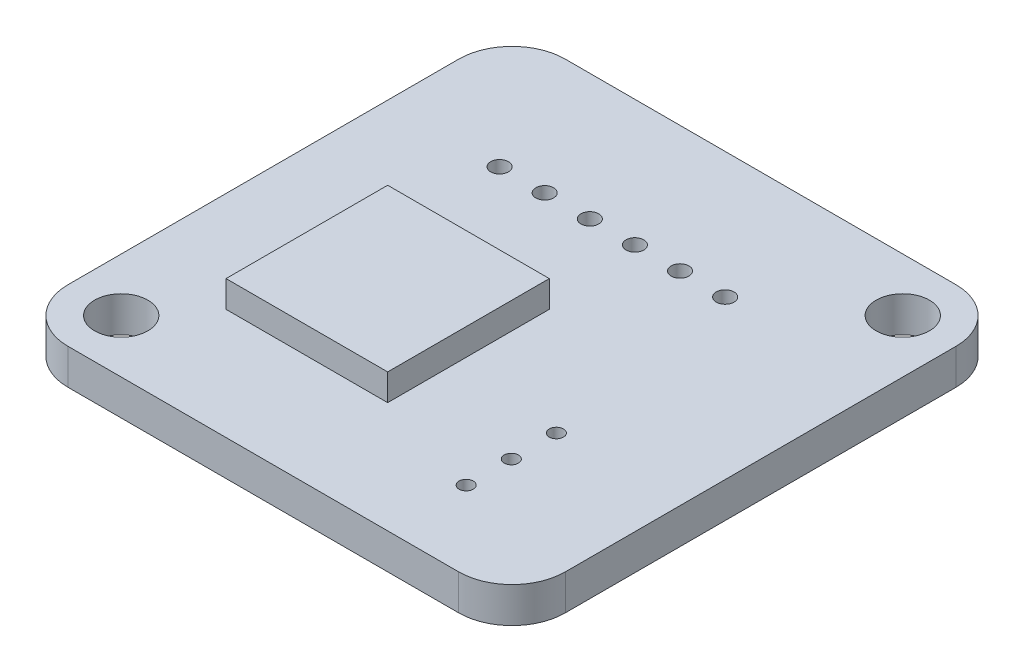
ISO-10303-21;
HEADER;
FILE_DESCRIPTION(('STEP AP214'),'2;1');
FILE_NAME('part.step','',(''),(''),'','','');
FILE_SCHEMA(('AUTOMOTIVE_DESIGN { 1 0 10303 214 1 1 1 1 }'));
ENDSEC;
DATA;
#1=APPLICATION_CONTEXT('core data for automotive mechanical design processes');
#2=APPLICATION_PROTOCOL_DEFINITION('international standard','automotive_design',2000,#1);
#3=PRODUCT_CONTEXT('',#1,'mechanical');
#4=PRODUCT('Part','Part','',(#3));
#5=PRODUCT_RELATED_PRODUCT_CATEGORY('part','',(#4));
#6=PRODUCT_DEFINITION_FORMATION('','',#4);
#7=PRODUCT_DEFINITION_CONTEXT('part definition',#1,'design');
#8=PRODUCT_DEFINITION('design','',#6,#7);
#9=PRODUCT_DEFINITION_SHAPE('','',#8);
#10=(LENGTH_UNIT() NAMED_UNIT(*) SI_UNIT(.MILLI.,.METRE.));
#11=(NAMED_UNIT(*) PLANE_ANGLE_UNIT() SI_UNIT($,.RADIAN.));
#12=(NAMED_UNIT(*) SI_UNIT($,.STERADIAN.) SOLID_ANGLE_UNIT());
#13=UNCERTAINTY_MEASURE_WITH_UNIT(LENGTH_MEASURE(1.E-05),#10,'distance_accuracy_value','');
#14=(GEOMETRIC_REPRESENTATION_CONTEXT(3) GLOBAL_UNCERTAINTY_ASSIGNED_CONTEXT((#13)) GLOBAL_UNIT_ASSIGNED_CONTEXT((#10,
#11,#12)) REPRESENTATION_CONTEXT('',''));
#15=CARTESIAN_POINT('',(0.,0.,0.));
#16=DIRECTION('',(0.,0.,1.));
#17=DIRECTION('',(1.,0.,0.));
#18=AXIS2_PLACEMENT_3D('',#15,#16,#17);
#19=CARTESIAN_POINT('',(22.,2.,0.));
#20=DIRECTION('',(0.,1.,0.));
#21=DIRECTION('',(0.,0.,1.));
#22=AXIS2_PLACEMENT_3D('',#19,#20,#21);
#23=PLANE('',#22);
#24=CARTESIAN_POINT('',(17.98,2.,-6.52));
#25=DIRECTION('',(0.,1.,0.));
#26=DIRECTION('',(0.,0.,1.));
#27=AXIS2_PLACEMENT_3D('',#24,#25,#26);
#28=CIRCLE('',#27,0.400000000000001);
#29=CARTESIAN_POINT('',(17.98,2.,-6.12));
#30=VERTEX_POINT('',#29);
#31=EDGE_CURVE('E290',#30,#30,#28,.T.);
#32=ORIENTED_EDGE('',*,*,#31,.F.);
#33=EDGE_LOOP('',(#32));
#34=FACE_BOUND('',#33,.T.);
#35=CARTESIAN_POINT('',(17.98,2.,-3.98));
#36=DIRECTION('',(0.,1.,0.));
#37=DIRECTION('',(0.,0.,1.));
#38=AXIS2_PLACEMENT_3D('',#35,#36,#37);
#39=CIRCLE('',#38,0.400000000000001);
#40=CARTESIAN_POINT('',(17.98,2.,-3.58));
#41=VERTEX_POINT('',#40);
#42=EDGE_CURVE('E284',#41,#41,#39,.T.);
#43=ORIENTED_EDGE('',*,*,#42,.F.);
#44=EDGE_LOOP('',(#43));
#45=FACE_BOUND('',#44,.T.);
#46=CARTESIAN_POINT('',(17.98,2.,-1.44));
#47=DIRECTION('',(0.,1.,0.));
#48=DIRECTION('',(0.,0.,1.));
#49=AXIS2_PLACEMENT_3D('',#46,#47,#48);
#50=CIRCLE('',#49,0.400000000000001);
#51=CARTESIAN_POINT('',(17.98,2.,-1.04));
#52=VERTEX_POINT('',#51);
#53=EDGE_CURVE('E278',#52,#52,#50,.T.);
#54=ORIENTED_EDGE('',*,*,#53,.F.);
#55=EDGE_LOOP('',(#54));
#56=FACE_BOUND('',#55,.T.);
#57=CARTESIAN_POINT('',(22.,2.,-22.));
#58=DIRECTION('',(0.,1.,0.));
#59=DIRECTION('',(0.,0.,1.));
#60=AXIS2_PLACEMENT_3D('',#57,#58,#59);
#61=CIRCLE('',#60,1.5);
#62=CARTESIAN_POINT('',(22.,2.,-20.5));
#63=VERTEX_POINT('',#62);
#64=EDGE_CURVE('E199',#63,#63,#61,.T.);
#65=ORIENTED_EDGE('',*,*,#64,.F.);
#66=EDGE_LOOP('',(#65));
#67=FACE_BOUND('',#66,.T.);
#68=CARTESIAN_POINT('',(22.,2.,0.));
#69=DIRECTION('',(0.,1.,0.));
#70=DIRECTION('',(0.,0.,1.));
#71=AXIS2_PLACEMENT_3D('',#68,#69,#70);
#72=CIRCLE('',#71,3.);
#73=CARTESIAN_POINT('',(22.,2.,3.));
#74=VERTEX_POINT('',#73);
#75=CARTESIAN_POINT('',(25.,2.,0.));
#76=VERTEX_POINT('',#75);
#77=EDGE_CURVE('E162',#74,#76,#72,.T.);
#78=ORIENTED_EDGE('',*,*,#77,.T.);
#79=DIRECTION('',(0.,0.,-1.));
#80=VECTOR('',#79,1.);
#81=CARTESIAN_POINT('',(25.,2.,0.));
#82=LINE('',#81,#80);
#83=CARTESIAN_POINT('',(25.,2.,-22.));
#84=VERTEX_POINT('',#83);
#85=EDGE_CURVE('E102',#76,#84,#82,.T.);
#86=ORIENTED_EDGE('',*,*,#85,.T.);
#87=CARTESIAN_POINT('',(22.,2.,-22.));
#88=DIRECTION('',(0.,1.,0.));
#89=DIRECTION('',(0.,0.,1.));
#90=AXIS2_PLACEMENT_3D('',#87,#88,#89);
#91=CIRCLE('',#90,3.);
#92=CARTESIAN_POINT('',(22.,2.,-25.));
#93=VERTEX_POINT('',#92);
#94=EDGE_CURVE('E177',#84,#93,#91,.T.);
#95=ORIENTED_EDGE('',*,*,#94,.T.);
#96=DIRECTION('',(-1.,0.,0.));
#97=VECTOR('',#96,1.);
#98=CARTESIAN_POINT('',(0.,2.,-25.));
#99=LINE('',#98,#97);
#100=CARTESIAN_POINT('',(0.,2.,-25.));
#101=VERTEX_POINT('',#100);
#102=EDGE_CURVE('E190',#93,#101,#99,.T.);
#103=ORIENTED_EDGE('',*,*,#102,.T.);
#104=CARTESIAN_POINT('',(0.,2.,-22.));
#105=DIRECTION('',(0.,1.,0.));
#106=DIRECTION('',(0.,0.,-1.));
#107=AXIS2_PLACEMENT_3D('',#104,#105,#106);
#108=CIRCLE('',#107,3.);
#109=CARTESIAN_POINT('',(-3.,2.,-22.));
#110=VERTEX_POINT('',#109);
#111=EDGE_CURVE('E125',#101,#110,#108,.T.);
#112=ORIENTED_EDGE('',*,*,#111,.T.);
#113=DIRECTION('',(0.,0.,1.));
#114=VECTOR('',#113,1.);
#115=CARTESIAN_POINT('',(-3.,2.,0.));
#116=LINE('',#115,#114);
#117=CARTESIAN_POINT('',(-3.,2.,0.));
#118=VERTEX_POINT('',#117);
#119=EDGE_CURVE('E118',#110,#118,#116,.T.);
#120=ORIENTED_EDGE('',*,*,#119,.T.);
#121=CARTESIAN_POINT('',(0.,2.,0.));
#122=DIRECTION('',(0.,1.,0.));
#123=DIRECTION('',(0.,0.,-1.));
#124=AXIS2_PLACEMENT_3D('',#121,#122,#123);
#125=CIRCLE('',#124,3.);
#126=CARTESIAN_POINT('',(0.,2.,3.));
#127=VERTEX_POINT('',#126);
#128=EDGE_CURVE('E122',#118,#127,#125,.T.);
#129=ORIENTED_EDGE('',*,*,#128,.T.);
#130=DIRECTION('',(1.,0.,0.));
#131=VECTOR('',#130,1.);
#132=CARTESIAN_POINT('',(0.,2.,3.));
#133=LINE('',#132,#131);
#134=EDGE_CURVE('E61',#127,#74,#133,.T.);
#135=ORIENTED_EDGE('',*,*,#134,.T.);
#136=EDGE_LOOP('',(#78,#86,#95,#103,#112,#120,#129,#135));
#137=FACE_BOUND('',#136,.T.);
#138=CARTESIAN_POINT('',(0.,2.,0.));
#139=DIRECTION('',(0.,1.,0.));
#140=DIRECTION('',(0.,0.,1.));
#141=AXIS2_PLACEMENT_3D('',#138,#139,#140);
#142=CIRCLE('',#141,1.5);
#143=CARTESIAN_POINT('',(0.,2.,1.5));
#144=VERTEX_POINT('',#143);
#145=EDGE_CURVE('E150',#144,#144,#142,.T.);
#146=ORIENTED_EDGE('',*,*,#145,.F.);
#147=EDGE_LOOP('',(#146));
#148=FACE_BOUND('',#147,.T.);
#149=CARTESIAN_POINT('',(5.94,2.,-17.9));
#150=DIRECTION('',(0.,1.,0.));
#151=DIRECTION('',(0.,0.,1.));
#152=AXIS2_PLACEMENT_3D('',#149,#150,#151);
#153=CIRCLE('',#152,0.500000000000003);
#154=CARTESIAN_POINT('',(5.94,2.,-17.4));
#155=VERTEX_POINT('',#154);
#156=EDGE_CURVE('E210',#155,#155,#153,.T.);
#157=ORIENTED_EDGE('',*,*,#156,.F.);
#158=EDGE_LOOP('',(#157));
#159=FACE_BOUND('',#158,.T.);
#160=CARTESIAN_POINT('',(8.47999999999999,2.,-17.9));
#161=DIRECTION('',(0.,1.,0.));
#162=DIRECTION('',(0.,0.,1.));
#163=AXIS2_PLACEMENT_3D('',#160,#161,#162);
#164=CIRCLE('',#163,0.500000000000003);
#165=CARTESIAN_POINT('',(8.47999999999999,2.,-17.4));
#166=VERTEX_POINT('',#165);
#167=EDGE_CURVE('E216',#166,#166,#164,.T.);
#168=ORIENTED_EDGE('',*,*,#167,.F.);
#169=EDGE_LOOP('',(#168));
#170=FACE_BOUND('',#169,.T.);
#171=CARTESIAN_POINT('',(11.02,2.,-17.9));
#172=DIRECTION('',(0.,1.,0.));
#173=DIRECTION('',(0.,0.,1.));
#174=AXIS2_PLACEMENT_3D('',#171,#172,#173);
#175=CIRCLE('',#174,0.500000000000003);
#176=CARTESIAN_POINT('',(11.02,2.,-17.4));
#177=VERTEX_POINT('',#176);
#178=EDGE_CURVE('E222',#177,#177,#175,.T.);
#179=ORIENTED_EDGE('',*,*,#178,.F.);
#180=EDGE_LOOP('',(#179));
#181=FACE_BOUND('',#180,.T.);
#182=CARTESIAN_POINT('',(13.56,2.,-17.9));
#183=DIRECTION('',(0.,1.,0.));
#184=DIRECTION('',(0.,0.,1.));
#185=AXIS2_PLACEMENT_3D('',#182,#183,#184);
#186=CIRCLE('',#185,0.500000000000003);
#187=CARTESIAN_POINT('',(13.56,2.,-17.4));
#188=VERTEX_POINT('',#187);
#189=EDGE_CURVE('E228',#188,#188,#186,.T.);
#190=ORIENTED_EDGE('',*,*,#189,.F.);
#191=EDGE_LOOP('',(#190));
#192=FACE_BOUND('',#191,.T.);
#193=CARTESIAN_POINT('',(16.1,2.,-17.9));
#194=DIRECTION('',(0.,1.,0.));
#195=DIRECTION('',(0.,0.,1.));
#196=AXIS2_PLACEMENT_3D('',#193,#194,#195);
#197=CIRCLE('',#196,0.500000000000003);
#198=CARTESIAN_POINT('',(16.1,2.,-17.4));
#199=VERTEX_POINT('',#198);
#200=EDGE_CURVE('E234',#199,#199,#197,.T.);
#201=ORIENTED_EDGE('',*,*,#200,.F.);
#202=EDGE_LOOP('',(#201));
#203=FACE_BOUND('',#202,.T.);
#204=CARTESIAN_POINT('',(3.4,2.,-17.9));
#205=DIRECTION('',(0.,1.,0.));
#206=DIRECTION('',(0.,0.,1.));
#207=AXIS2_PLACEMENT_3D('',#204,#205,#206);
#208=CIRCLE('',#207,0.500000000000002);
#209=CARTESIAN_POINT('',(3.4,2.,-17.4));
#210=VERTEX_POINT('',#209);
#211=EDGE_CURVE('E240',#210,#210,#208,.T.);
#212=ORIENTED_EDGE('',*,*,#211,.F.);
#213=EDGE_LOOP('',(#212));
#214=FACE_BOUND('',#213,.T.);
#215=DIRECTION('',(0.,0.,1.));
#216=VECTOR('',#215,1.);
#217=CARTESIAN_POINT('',(2.65,2.,-12.35));
#218=LINE('',#217,#216);
#219=CARTESIAN_POINT('',(2.65,2.,-12.35));
#220=VERTEX_POINT('',#219);
#221=CARTESIAN_POINT('',(2.65,2.,-3.25));
#222=VERTEX_POINT('',#221);
#223=EDGE_CURVE('E259',#220,#222,#218,.T.);
#224=ORIENTED_EDGE('',*,*,#223,.F.);
#225=DIRECTION('',(-1.,0.,0.));
#226=VECTOR('',#225,1.);
#227=CARTESIAN_POINT('',(2.65,2.,-12.35));
#228=LINE('',#227,#226);
#229=CARTESIAN_POINT('',(11.75,2.,-12.35));
#230=VERTEX_POINT('',#229);
#231=EDGE_CURVE('E262',#230,#220,#228,.T.);
#232=ORIENTED_EDGE('',*,*,#231,.F.);
#233=DIRECTION('',(0.,0.,-1.));
#234=VECTOR('',#233,1.);
#235=CARTESIAN_POINT('',(11.75,2.,-12.35));
#236=LINE('',#235,#234);
#237=CARTESIAN_POINT('',(11.75,2.,-3.25));
#238=VERTEX_POINT('',#237);
#239=EDGE_CURVE('E254',#238,#230,#236,.T.);
#240=ORIENTED_EDGE('',*,*,#239,.F.);
#241=DIRECTION('',(1.,0.,0.));
#242=VECTOR('',#241,1.);
#243=CARTESIAN_POINT('',(2.65,2.,-3.25));
#244=LINE('',#243,#242);
#245=EDGE_CURVE('E257',#222,#238,#244,.T.);
#246=ORIENTED_EDGE('',*,*,#245,.F.);
#247=EDGE_LOOP('',(#224,#232,#240,#246));
#248=FACE_BOUND('',#247,.T.);
#249=ADVANCED_FACE('F37',(#34,#45,#56,#67,#137,#148,#159,#170,#181,#192,#203,#214,#248),#23,.T.);
#250=CARTESIAN_POINT('',(22.,0.,0.));
#251=DIRECTION('',(0.,1.,0.));
#252=DIRECTION('',(0.,0.,1.));
#253=AXIS2_PLACEMENT_3D('',#250,#251,#252);
#254=PLANE('',#253);
#255=CARTESIAN_POINT('',(17.98,0.,-6.52));
#256=DIRECTION('',(0.,1.,0.));
#257=DIRECTION('',(0.,0.,1.));
#258=AXIS2_PLACEMENT_3D('',#255,#256,#257);
#259=CIRCLE('',#258,0.400000000000001);
#260=CARTESIAN_POINT('',(17.98,0.,-6.12));
#261=VERTEX_POINT('',#260);
#262=EDGE_CURVE('E287',#261,#261,#259,.F.);
#263=ORIENTED_EDGE('',*,*,#262,.F.);
#264=EDGE_LOOP('',(#263));
#265=FACE_BOUND('',#264,.T.);
#266=CARTESIAN_POINT('',(17.98,0.,-3.98));
#267=DIRECTION('',(0.,1.,0.));
#268=DIRECTION('',(0.,0.,1.));
#269=AXIS2_PLACEMENT_3D('',#266,#267,#268);
#270=CIRCLE('',#269,0.400000000000001);
#271=CARTESIAN_POINT('',(17.98,0.,-3.58));
#272=VERTEX_POINT('',#271);
#273=EDGE_CURVE('E281',#272,#272,#270,.F.);
#274=ORIENTED_EDGE('',*,*,#273,.F.);
#275=EDGE_LOOP('',(#274));
#276=FACE_BOUND('',#275,.T.);
#277=CARTESIAN_POINT('',(17.98,0.,-1.44));
#278=DIRECTION('',(0.,1.,0.));
#279=DIRECTION('',(0.,0.,1.));
#280=AXIS2_PLACEMENT_3D('',#277,#278,#279);
#281=CIRCLE('',#280,0.400000000000001);
#282=CARTESIAN_POINT('',(17.98,0.,-1.04));
#283=VERTEX_POINT('',#282);
#284=EDGE_CURVE('E265',#283,#283,#281,.F.);
#285=ORIENTED_EDGE('',*,*,#284,.F.);
#286=EDGE_LOOP('',(#285));
#287=FACE_BOUND('',#286,.T.);
#288=CARTESIAN_POINT('',(3.4,0.,-17.9));
#289=DIRECTION('',(0.,1.,0.));
#290=DIRECTION('',(0.,0.,1.));
#291=AXIS2_PLACEMENT_3D('',#288,#289,#290);
#292=CIRCLE('',#291,0.500000000000002);
#293=CARTESIAN_POINT('',(3.4,0.,-17.4));
#294=VERTEX_POINT('',#293);
#295=EDGE_CURVE('E237',#294,#294,#292,.F.);
#296=ORIENTED_EDGE('',*,*,#295,.F.);
#297=EDGE_LOOP('',(#296));
#298=FACE_BOUND('',#297,.T.);
#299=CARTESIAN_POINT('',(16.1,0.,-17.9));
#300=DIRECTION('',(0.,1.,0.));
#301=DIRECTION('',(0.,0.,1.));
#302=AXIS2_PLACEMENT_3D('',#299,#300,#301);
#303=CIRCLE('',#302,0.500000000000003);
#304=CARTESIAN_POINT('',(16.1,0.,-17.4));
#305=VERTEX_POINT('',#304);
#306=EDGE_CURVE('E231',#305,#305,#303,.F.);
#307=ORIENTED_EDGE('',*,*,#306,.F.);
#308=EDGE_LOOP('',(#307));
#309=FACE_BOUND('',#308,.T.);
#310=CARTESIAN_POINT('',(13.56,0.,-17.9));
#311=DIRECTION('',(0.,1.,0.));
#312=DIRECTION('',(0.,0.,1.));
#313=AXIS2_PLACEMENT_3D('',#310,#311,#312);
#314=CIRCLE('',#313,0.500000000000003);
#315=CARTESIAN_POINT('',(13.56,0.,-17.4));
#316=VERTEX_POINT('',#315);
#317=EDGE_CURVE('E225',#316,#316,#314,.F.);
#318=ORIENTED_EDGE('',*,*,#317,.F.);
#319=EDGE_LOOP('',(#318));
#320=FACE_BOUND('',#319,.T.);
#321=CARTESIAN_POINT('',(11.02,0.,-17.9));
#322=DIRECTION('',(0.,1.,0.));
#323=DIRECTION('',(0.,0.,1.));
#324=AXIS2_PLACEMENT_3D('',#321,#322,#323);
#325=CIRCLE('',#324,0.500000000000003);
#326=CARTESIAN_POINT('',(11.02,0.,-17.4));
#327=VERTEX_POINT('',#326);
#328=EDGE_CURVE('E219',#327,#327,#325,.F.);
#329=ORIENTED_EDGE('',*,*,#328,.F.);
#330=EDGE_LOOP('',(#329));
#331=FACE_BOUND('',#330,.T.);
#332=CARTESIAN_POINT('',(8.47999999999999,0.,-17.9));
#333=DIRECTION('',(0.,1.,0.));
#334=DIRECTION('',(0.,0.,1.));
#335=AXIS2_PLACEMENT_3D('',#332,#333,#334);
#336=CIRCLE('',#335,0.500000000000003);
#337=CARTESIAN_POINT('',(8.47999999999999,0.,-17.4));
#338=VERTEX_POINT('',#337);
#339=EDGE_CURVE('E213',#338,#338,#336,.F.);
#340=ORIENTED_EDGE('',*,*,#339,.F.);
#341=EDGE_LOOP('',(#340));
#342=FACE_BOUND('',#341,.T.);
#343=CARTESIAN_POINT('',(5.94,0.,-17.9));
#344=DIRECTION('',(0.,1.,0.));
#345=DIRECTION('',(0.,0.,1.));
#346=AXIS2_PLACEMENT_3D('',#343,#344,#345);
#347=CIRCLE('',#346,0.500000000000003);
#348=CARTESIAN_POINT('',(5.94,0.,-17.4));
#349=VERTEX_POINT('',#348);
#350=EDGE_CURVE('E205',#349,#349,#347,.F.);
#351=ORIENTED_EDGE('',*,*,#350,.F.);
#352=EDGE_LOOP('',(#351));
#353=FACE_BOUND('',#352,.T.);
#354=CARTESIAN_POINT('',(0.,0.,0.));
#355=DIRECTION('',(0.,1.,0.));
#356=DIRECTION('',(0.,0.,1.));
#357=AXIS2_PLACEMENT_3D('',#354,#355,#356);
#358=CIRCLE('',#357,1.5);
#359=CARTESIAN_POINT('',(0.,0.,1.5));
#360=VERTEX_POINT('',#359);
#361=EDGE_CURVE('E196',#360,#360,#358,.T.);
#362=ORIENTED_EDGE('',*,*,#361,.T.);
#363=EDGE_LOOP('',(#362));
#364=FACE_BOUND('',#363,.T.);
#365=CARTESIAN_POINT('',(22.,0.,0.));
#366=DIRECTION('',(0.,1.,0.));
#367=DIRECTION('',(0.,0.,1.));
#368=AXIS2_PLACEMENT_3D('',#365,#366,#367);
#369=CIRCLE('',#368,3.);
#370=CARTESIAN_POINT('',(22.,0.,3.));
#371=VERTEX_POINT('',#370);
#372=CARTESIAN_POINT('',(25.,0.,0.));
#373=VERTEX_POINT('',#372);
#374=EDGE_CURVE('E146',#371,#373,#369,.T.);
#375=ORIENTED_EDGE('',*,*,#374,.F.);
#376=DIRECTION('',(1.,0.,0.));
#377=VECTOR('',#376,1.);
#378=CARTESIAN_POINT('',(0.,0.,3.));
#379=LINE('',#378,#377);
#380=CARTESIAN_POINT('',(0.,0.,3.));
#381=VERTEX_POINT('',#380);
#382=EDGE_CURVE('E94',#381,#371,#379,.T.);
#383=ORIENTED_EDGE('',*,*,#382,.F.);
#384=CARTESIAN_POINT('',(0.,0.,0.));
#385=DIRECTION('',(0.,1.,0.));
#386=DIRECTION('',(0.,0.,-1.));
#387=AXIS2_PLACEMENT_3D('',#384,#385,#386);
#388=CIRCLE('',#387,3.);
#389=CARTESIAN_POINT('',(-3.,0.,0.));
#390=VERTEX_POINT('',#389);
#391=EDGE_CURVE('E159',#390,#381,#388,.T.);
#392=ORIENTED_EDGE('',*,*,#391,.F.);
#393=DIRECTION('',(0.,0.,1.));
#394=VECTOR('',#393,1.);
#395=CARTESIAN_POINT('',(-3.,0.,0.));
#396=LINE('',#395,#394);
#397=CARTESIAN_POINT('',(-3.,0.,-22.));
#398=VERTEX_POINT('',#397);
#399=EDGE_CURVE('E134',#398,#390,#396,.T.);
#400=ORIENTED_EDGE('',*,*,#399,.F.);
#401=CARTESIAN_POINT('',(0.,0.,-22.));
#402=DIRECTION('',(0.,1.,0.));
#403=DIRECTION('',(0.,0.,-1.));
#404=AXIS2_PLACEMENT_3D('',#401,#402,#403);
#405=CIRCLE('',#404,3.);
#406=CARTESIAN_POINT('',(0.,0.,-25.));
#407=VERTEX_POINT('',#406);
#408=EDGE_CURVE('E156',#407,#398,#405,.T.);
#409=ORIENTED_EDGE('',*,*,#408,.F.);
#410=DIRECTION('',(-1.,0.,0.));
#411=VECTOR('',#410,1.);
#412=CARTESIAN_POINT('',(0.,0.,-25.));
#413=LINE('',#412,#411);
#414=CARTESIAN_POINT('',(22.,0.,-25.));
#415=VERTEX_POINT('',#414);
#416=EDGE_CURVE('E154',#415,#407,#413,.T.);
#417=ORIENTED_EDGE('',*,*,#416,.F.);
#418=CARTESIAN_POINT('',(22.,0.,-22.));
#419=DIRECTION('',(0.,1.,0.));
#420=DIRECTION('',(0.,0.,1.));
#421=AXIS2_PLACEMENT_3D('',#418,#419,#420);
#422=CIRCLE('',#421,3.);
#423=CARTESIAN_POINT('',(25.,0.,-22.));
#424=VERTEX_POINT('',#423);
#425=EDGE_CURVE('E152',#424,#415,#422,.T.);
#426=ORIENTED_EDGE('',*,*,#425,.F.);
#427=DIRECTION('',(0.,0.,-1.));
#428=VECTOR('',#427,1.);
#429=CARTESIAN_POINT('',(25.,0.,0.));
#430=LINE('',#429,#428);
#431=EDGE_CURVE('E149',#373,#424,#430,.T.);
#432=ORIENTED_EDGE('',*,*,#431,.F.);
#433=EDGE_LOOP('',(#375,#383,#392,#400,#409,#417,#426,#432));
#434=FACE_BOUND('',#433,.T.);
#435=CARTESIAN_POINT('',(22.,0.,-22.));
#436=DIRECTION('',(0.,1.,0.));
#437=DIRECTION('',(0.,0.,1.));
#438=AXIS2_PLACEMENT_3D('',#435,#436,#437);
#439=CIRCLE('',#438,1.5);
#440=CARTESIAN_POINT('',(22.,0.,-20.5));
#441=VERTEX_POINT('',#440);
#442=EDGE_CURVE('E202',#441,#441,#439,.T.);
#443=ORIENTED_EDGE('',*,*,#442,.T.);
#444=EDGE_LOOP('',(#443));
#445=FACE_BOUND('',#444,.T.);
#446=ADVANCED_FACE('F181',(#265,#276,#287,#298,#309,#320,#331,#342,#353,#364,#434,#445),#254,.F.);
#447=CARTESIAN_POINT('',(22.,2.,0.));
#448=DIRECTION('',(0.,-1.,0.));
#449=DIRECTION('',(0.,0.,-1.));
#450=AXIS2_PLACEMENT_3D('',#447,#448,#449);
#451=CYLINDRICAL_SURFACE('',#450,3.);
#452=ORIENTED_EDGE('',*,*,#374,.T.);
#453=DIRECTION('',(0.,-1.,0.));
#454=VECTOR('',#453,1.);
#455=CARTESIAN_POINT('',(25.,2.,0.));
#456=LINE('',#455,#454);
#457=EDGE_CURVE('E11',#76,#373,#456,.T.);
#458=ORIENTED_EDGE('',*,*,#457,.F.);
#459=ORIENTED_EDGE('',*,*,#77,.F.);
#460=DIRECTION('',(0.,-1.,0.));
#461=VECTOR('',#460,1.);
#462=CARTESIAN_POINT('',(22.,2.,3.));
#463=LINE('',#462,#461);
#464=EDGE_CURVE('E142',#74,#371,#463,.T.);
#465=ORIENTED_EDGE('',*,*,#464,.T.);
#466=EDGE_LOOP('',(#452,#458,#459,#465));
#467=FACE_BOUND('',#466,.T.);
#468=ADVANCED_FACE('F39',(#467),#451,.T.);
#469=CARTESIAN_POINT('',(25.,2.,0.));
#470=DIRECTION('',(-1.,0.,0.));
#471=DIRECTION('',(0.,0.,1.));
#472=AXIS2_PLACEMENT_3D('',#469,#470,#471);
#473=PLANE('',#472);
#474=ORIENTED_EDGE('',*,*,#431,.T.);
#475=DIRECTION('',(0.,-1.,0.));
#476=VECTOR('',#475,1.);
#477=CARTESIAN_POINT('',(25.,2.,-22.));
#478=LINE('',#477,#476);
#479=EDGE_CURVE('E45',#84,#424,#478,.T.);
#480=ORIENTED_EDGE('',*,*,#479,.F.);
#481=ORIENTED_EDGE('',*,*,#85,.F.);
#482=ORIENTED_EDGE('',*,*,#457,.T.);
#483=EDGE_LOOP('',(#474,#480,#481,#482));
#484=FACE_BOUND('',#483,.T.);
#485=ADVANCED_FACE('F319',(#484),#473,.F.);
#486=CARTESIAN_POINT('',(22.,2.,-22.));
#487=DIRECTION('',(0.,-1.,0.));
#488=DIRECTION('',(0.,0.,-1.));
#489=AXIS2_PLACEMENT_3D('',#486,#487,#488);
#490=CYLINDRICAL_SURFACE('',#489,3.);
#491=ORIENTED_EDGE('',*,*,#425,.T.);
#492=DIRECTION('',(0.,-1.,0.));
#493=VECTOR('',#492,1.);
#494=CARTESIAN_POINT('',(22.,2.,-25.));
#495=LINE('',#494,#493);
#496=EDGE_CURVE('E169',#93,#415,#495,.T.);
#497=ORIENTED_EDGE('',*,*,#496,.F.);
#498=ORIENTED_EDGE('',*,*,#94,.F.);
#499=ORIENTED_EDGE('',*,*,#479,.T.);
#500=EDGE_LOOP('',(#491,#497,#498,#499));
#501=FACE_BOUND('',#500,.T.);
#502=ADVANCED_FACE('F175',(#501),#490,.T.);
#503=CARTESIAN_POINT('',(0.,2.,-25.));
#504=DIRECTION('',(0.,0.,1.));
#505=DIRECTION('',(1.,0.,0.));
#506=AXIS2_PLACEMENT_3D('',#503,#504,#505);
#507=PLANE('',#506);
#508=ORIENTED_EDGE('',*,*,#416,.T.);
#509=DIRECTION('',(0.,-1.,0.));
#510=VECTOR('',#509,1.);
#511=CARTESIAN_POINT('',(0.,2.,-25.));
#512=LINE('',#511,#510);
#513=EDGE_CURVE('E166',#101,#407,#512,.T.);
#514=ORIENTED_EDGE('',*,*,#513,.F.);
#515=ORIENTED_EDGE('',*,*,#102,.F.);
#516=ORIENTED_EDGE('',*,*,#496,.T.);
#517=EDGE_LOOP('',(#508,#514,#515,#516));
#518=FACE_BOUND('',#517,.T.);
#519=ADVANCED_FACE('F186',(#518),#507,.F.);
#520=CARTESIAN_POINT('',(0.,2.,-22.));
#521=DIRECTION('',(0.,-1.,0.));
#522=DIRECTION('',(0.,0.,-1.));
#523=AXIS2_PLACEMENT_3D('',#520,#521,#522);
#524=CYLINDRICAL_SURFACE('',#523,3.);
#525=ORIENTED_EDGE('',*,*,#408,.T.);
#526=DIRECTION('',(0.,-1.,0.));
#527=VECTOR('',#526,1.);
#528=CARTESIAN_POINT('',(-3.,2.,-22.));
#529=LINE('',#528,#527);
#530=EDGE_CURVE('E137',#110,#398,#529,.T.);
#531=ORIENTED_EDGE('',*,*,#530,.F.);
#532=ORIENTED_EDGE('',*,*,#111,.F.);
#533=ORIENTED_EDGE('',*,*,#513,.T.);
#534=EDGE_LOOP('',(#525,#531,#532,#533));
#535=FACE_BOUND('',#534,.T.);
#536=ADVANCED_FACE('F189',(#535),#524,.T.);
#537=CARTESIAN_POINT('',(-3.,2.,0.));
#538=DIRECTION('',(1.,0.,0.));
#539=DIRECTION('',(0.,0.,-1.));
#540=AXIS2_PLACEMENT_3D('',#537,#538,#539);
#541=PLANE('',#540);
#542=ORIENTED_EDGE('',*,*,#399,.T.);
#543=DIRECTION('',(0.,-1.,0.));
#544=VECTOR('',#543,1.);
#545=CARTESIAN_POINT('',(-3.,2.,0.));
#546=LINE('',#545,#544);
#547=EDGE_CURVE('E131',#118,#390,#546,.T.);
#548=ORIENTED_EDGE('',*,*,#547,.F.);
#549=ORIENTED_EDGE('',*,*,#119,.F.);
#550=ORIENTED_EDGE('',*,*,#530,.T.);
#551=EDGE_LOOP('',(#542,#548,#549,#550));
#552=FACE_BOUND('',#551,.T.);
#553=ADVANCED_FACE('F132',(#552),#541,.F.);
#554=CARTESIAN_POINT('',(0.,2.,0.));
#555=DIRECTION('',(0.,-1.,0.));
#556=DIRECTION('',(0.,0.,-1.));
#557=AXIS2_PLACEMENT_3D('',#554,#555,#556);
#558=CYLINDRICAL_SURFACE('',#557,3.);
#559=ORIENTED_EDGE('',*,*,#391,.T.);
#560=DIRECTION('',(0.,-1.,0.));
#561=VECTOR('',#560,1.);
#562=CARTESIAN_POINT('',(0.,2.,3.));
#563=LINE('',#562,#561);
#564=EDGE_CURVE('E138',#127,#381,#563,.T.);
#565=ORIENTED_EDGE('',*,*,#564,.F.);
#566=ORIENTED_EDGE('',*,*,#128,.F.);
#567=ORIENTED_EDGE('',*,*,#547,.T.);
#568=EDGE_LOOP('',(#559,#565,#566,#567));
#569=FACE_BOUND('',#568,.T.);
#570=ADVANCED_FACE('F140',(#569),#558,.T.);
#571=CARTESIAN_POINT('',(0.,2.,3.));
#572=DIRECTION('',(0.,0.,-1.));
#573=DIRECTION('',(-1.,0.,0.));
#574=AXIS2_PLACEMENT_3D('',#571,#572,#573);
#575=PLANE('',#574);
#576=ORIENTED_EDGE('',*,*,#382,.T.);
#577=ORIENTED_EDGE('',*,*,#464,.F.);
#578=ORIENTED_EDGE('',*,*,#134,.F.);
#579=ORIENTED_EDGE('',*,*,#564,.T.);
#580=EDGE_LOOP('',(#576,#577,#578,#579));
#581=FACE_BOUND('',#580,.T.);
#582=ADVANCED_FACE('F325',(#581),#575,.F.);
#583=CARTESIAN_POINT('',(0.,2.,0.));
#584=DIRECTION('',(0.,-1.,0.));
#585=DIRECTION('',(0.,0.,-1.));
#586=AXIS2_PLACEMENT_3D('',#583,#584,#585);
#587=CYLINDRICAL_SURFACE('',#586,1.5);
#588=ORIENTED_EDGE('',*,*,#145,.T.);
#589=EDGE_LOOP('',(#588));
#590=FACE_BOUND('',#589,.T.);
#591=ORIENTED_EDGE('',*,*,#361,.F.);
#592=EDGE_LOOP('',(#591));
#593=FACE_BOUND('',#592,.T.);
#594=ADVANCED_FACE('F310',(#590,#593),#587,.F.);
#595=CARTESIAN_POINT('',(22.,2.,-22.));
#596=DIRECTION('',(0.,-1.,0.));
#597=DIRECTION('',(0.,0.,-1.));
#598=AXIS2_PLACEMENT_3D('',#595,#596,#597);
#599=CYLINDRICAL_SURFACE('',#598,1.5);
#600=ORIENTED_EDGE('',*,*,#64,.T.);
#601=EDGE_LOOP('',(#600));
#602=FACE_BOUND('',#601,.T.);
#603=ORIENTED_EDGE('',*,*,#442,.F.);
#604=EDGE_LOOP('',(#603));
#605=FACE_BOUND('',#604,.T.);
#606=ADVANCED_FACE('F306',(#602,#605),#599,.F.);
#607=CARTESIAN_POINT('',(5.94,-0.00100000000000013,-17.9));
#608=DIRECTION('',(0.,1.,0.));
#609=DIRECTION('',(0.,0.,1.));
#610=AXIS2_PLACEMENT_3D('',#607,#608,#609);
#611=CYLINDRICAL_SURFACE('',#610,0.500000000000003);
#612=ORIENTED_EDGE('',*,*,#156,.T.);
#613=EDGE_LOOP('',(#612));
#614=FACE_BOUND('',#613,.T.);
#615=ORIENTED_EDGE('',*,*,#350,.T.);
#616=EDGE_LOOP('',(#615));
#617=FACE_BOUND('',#616,.T.);
#618=ADVANCED_FACE('F309',(#614,#617),#611,.F.);
#619=CARTESIAN_POINT('',(8.47999999999999,-0.00100000000000013,-17.9));
#620=DIRECTION('',(0.,1.,0.));
#621=DIRECTION('',(0.,0.,1.));
#622=AXIS2_PLACEMENT_3D('',#619,#620,#621);
#623=CYLINDRICAL_SURFACE('',#622,0.500000000000003);
#624=ORIENTED_EDGE('',*,*,#167,.T.);
#625=EDGE_LOOP('',(#624));
#626=FACE_BOUND('',#625,.T.);
#627=ORIENTED_EDGE('',*,*,#339,.T.);
#628=EDGE_LOOP('',(#627));
#629=FACE_BOUND('',#628,.T.);
#630=ADVANCED_FACE('F384',(#626,#629),#623,.F.);
#631=CARTESIAN_POINT('',(11.02,-0.00100000000000013,-17.9));
#632=DIRECTION('',(0.,1.,0.));
#633=DIRECTION('',(0.,0.,1.));
#634=AXIS2_PLACEMENT_3D('',#631,#632,#633);
#635=CYLINDRICAL_SURFACE('',#634,0.500000000000003);
#636=ORIENTED_EDGE('',*,*,#178,.T.);
#637=EDGE_LOOP('',(#636));
#638=FACE_BOUND('',#637,.T.);
#639=ORIENTED_EDGE('',*,*,#328,.T.);
#640=EDGE_LOOP('',(#639));
#641=FACE_BOUND('',#640,.T.);
#642=ADVANCED_FACE('F392',(#638,#641),#635,.F.);
#643=CARTESIAN_POINT('',(13.56,-0.00100000000000013,-17.9));
#644=DIRECTION('',(0.,1.,0.));
#645=DIRECTION('',(0.,0.,1.));
#646=AXIS2_PLACEMENT_3D('',#643,#644,#645);
#647=CYLINDRICAL_SURFACE('',#646,0.500000000000003);
#648=ORIENTED_EDGE('',*,*,#189,.T.);
#649=EDGE_LOOP('',(#648));
#650=FACE_BOUND('',#649,.T.);
#651=ORIENTED_EDGE('',*,*,#317,.T.);
#652=EDGE_LOOP('',(#651));
#653=FACE_BOUND('',#652,.T.);
#654=ADVANCED_FACE('F400',(#650,#653),#647,.F.);
#655=CARTESIAN_POINT('',(16.1,-0.00100000000000013,-17.9));
#656=DIRECTION('',(0.,1.,0.));
#657=DIRECTION('',(0.,0.,1.));
#658=AXIS2_PLACEMENT_3D('',#655,#656,#657);
#659=CYLINDRICAL_SURFACE('',#658,0.500000000000003);
#660=ORIENTED_EDGE('',*,*,#200,.T.);
#661=EDGE_LOOP('',(#660));
#662=FACE_BOUND('',#661,.T.);
#663=ORIENTED_EDGE('',*,*,#306,.T.);
#664=EDGE_LOOP('',(#663));
#665=FACE_BOUND('',#664,.T.);
#666=ADVANCED_FACE('F408',(#662,#665),#659,.F.);
#667=CARTESIAN_POINT('',(3.4,-0.00100000000000013,-17.9));
#668=DIRECTION('',(0.,1.,0.));
#669=DIRECTION('',(0.,0.,1.));
#670=AXIS2_PLACEMENT_3D('',#667,#668,#669);
#671=CYLINDRICAL_SURFACE('',#670,0.500000000000002);
#672=ORIENTED_EDGE('',*,*,#211,.T.);
#673=EDGE_LOOP('',(#672));
#674=FACE_BOUND('',#673,.T.);
#675=ORIENTED_EDGE('',*,*,#295,.T.);
#676=EDGE_LOOP('',(#675));
#677=FACE_BOUND('',#676,.T.);
#678=ADVANCED_FACE('F416',(#674,#677),#671,.F.);
#679=CARTESIAN_POINT('',(2.65,3.5,-12.35));
#680=DIRECTION('',(0.,0.,1.));
#681=DIRECTION('',(1.,0.,0.));
#682=AXIS2_PLACEMENT_3D('',#679,#680,#681);
#683=PLANE('',#682);
#684=ORIENTED_EDGE('',*,*,#231,.T.);
#685=DIRECTION('',(0.,-1.,0.));
#686=VECTOR('',#685,1.);
#687=CARTESIAN_POINT('',(2.65,3.5,-12.35));
#688=LINE('',#687,#686);
#689=CARTESIAN_POINT('',(2.65,3.5,-12.35));
#690=VERTEX_POINT('',#689);
#691=EDGE_CURVE('E243',#690,#220,#688,.T.);
#692=ORIENTED_EDGE('',*,*,#691,.F.);
#693=DIRECTION('',(-1.,0.,0.));
#694=VECTOR('',#693,1.);
#695=CARTESIAN_POINT('',(2.65,3.5,-12.35));
#696=LINE('',#695,#694);
#697=CARTESIAN_POINT('',(11.75,3.5,-12.35));
#698=VERTEX_POINT('',#697);
#699=EDGE_CURVE('E256',#698,#690,#696,.T.);
#700=ORIENTED_EDGE('',*,*,#699,.F.);
#701=DIRECTION('',(0.,-1.,0.));
#702=VECTOR('',#701,1.);
#703=CARTESIAN_POINT('',(11.75,3.5,-12.35));
#704=LINE('',#703,#702);
#705=EDGE_CURVE('E250',#698,#230,#704,.T.);
#706=ORIENTED_EDGE('',*,*,#705,.T.);
#707=EDGE_LOOP('',(#684,#692,#700,#706));
#708=FACE_BOUND('',#707,.T.);
#709=ADVANCED_FACE('F424',(#708),#683,.F.);
#710=CARTESIAN_POINT('',(2.65,3.5,-12.35));
#711=DIRECTION('',(1.,0.,0.));
#712=DIRECTION('',(0.,0.,-1.));
#713=AXIS2_PLACEMENT_3D('',#710,#711,#712);
#714=PLANE('',#713);
#715=ORIENTED_EDGE('',*,*,#223,.T.);
#716=DIRECTION('',(0.,-1.,0.));
#717=VECTOR('',#716,1.);
#718=CARTESIAN_POINT('',(2.65,3.5,-3.25));
#719=LINE('',#718,#717);
#720=CARTESIAN_POINT('',(2.65,3.5,-3.25));
#721=VERTEX_POINT('',#720);
#722=EDGE_CURVE('E246',#721,#222,#719,.T.);
#723=ORIENTED_EDGE('',*,*,#722,.F.);
#724=DIRECTION('',(0.,0.,1.));
#725=VECTOR('',#724,1.);
#726=CARTESIAN_POINT('',(2.65,3.5,-12.35));
#727=LINE('',#726,#725);
#728=EDGE_CURVE('E271',#690,#721,#727,.T.);
#729=ORIENTED_EDGE('',*,*,#728,.F.);
#730=ORIENTED_EDGE('',*,*,#691,.T.);
#731=EDGE_LOOP('',(#715,#723,#729,#730));
#732=FACE_BOUND('',#731,.T.);
#733=ADVANCED_FACE('F432',(#732),#714,.F.);
#734=CARTESIAN_POINT('',(2.65,3.5,-3.25));
#735=DIRECTION('',(0.,0.,-1.));
#736=DIRECTION('',(-1.,0.,0.));
#737=AXIS2_PLACEMENT_3D('',#734,#735,#736);
#738=PLANE('',#737);
#739=ORIENTED_EDGE('',*,*,#245,.T.);
#740=DIRECTION('',(0.,-1.,0.));
#741=VECTOR('',#740,1.);
#742=CARTESIAN_POINT('',(11.75,3.5,-3.25));
#743=LINE('',#742,#741);
#744=CARTESIAN_POINT('',(11.75,3.5,-3.25));
#745=VERTEX_POINT('',#744);
#746=EDGE_CURVE('E52',#745,#238,#743,.T.);
#747=ORIENTED_EDGE('',*,*,#746,.F.);
#748=DIRECTION('',(1.,0.,0.));
#749=VECTOR('',#748,1.);
#750=CARTESIAN_POINT('',(2.65,3.5,-3.25));
#751=LINE('',#750,#749);
#752=EDGE_CURVE('E268',#721,#745,#751,.T.);
#753=ORIENTED_EDGE('',*,*,#752,.F.);
#754=ORIENTED_EDGE('',*,*,#722,.T.);
#755=EDGE_LOOP('',(#739,#747,#753,#754));
#756=FACE_BOUND('',#755,.T.);
#757=ADVANCED_FACE('F440',(#756),#738,.F.);
#758=CARTESIAN_POINT('',(11.75,3.5,-12.35));
#759=DIRECTION('',(-1.,0.,0.));
#760=DIRECTION('',(0.,0.,1.));
#761=AXIS2_PLACEMENT_3D('',#758,#759,#760);
#762=PLANE('',#761);
#763=ORIENTED_EDGE('',*,*,#239,.T.);
#764=ORIENTED_EDGE('',*,*,#705,.F.);
#765=DIRECTION('',(0.,0.,-1.));
#766=VECTOR('',#765,1.);
#767=CARTESIAN_POINT('',(11.75,3.5,-12.35));
#768=LINE('',#767,#766);
#769=EDGE_CURVE('E253',#745,#698,#768,.T.);
#770=ORIENTED_EDGE('',*,*,#769,.F.);
#771=ORIENTED_EDGE('',*,*,#746,.T.);
#772=EDGE_LOOP('',(#763,#764,#770,#771));
#773=FACE_BOUND('',#772,.T.);
#774=ADVANCED_FACE('F448',(#773),#762,.F.);
#775=CARTESIAN_POINT('',(0.,3.5,0.));
#776=DIRECTION('',(0.,-1.,0.));
#777=DIRECTION('',(0.,0.,-1.));
#778=AXIS2_PLACEMENT_3D('',#775,#776,#777);
#779=PLANE('',#778);
#780=ORIENTED_EDGE('',*,*,#699,.T.);
#781=ORIENTED_EDGE('',*,*,#728,.T.);
#782=ORIENTED_EDGE('',*,*,#752,.T.);
#783=ORIENTED_EDGE('',*,*,#769,.T.);
#784=EDGE_LOOP('',(#780,#781,#782,#783));
#785=FACE_BOUND('',#784,.T.);
#786=ADVANCED_FACE('F456',(#785),#779,.F.);
#787=CARTESIAN_POINT('',(17.98,-0.00100000000000013,-1.44));
#788=DIRECTION('',(0.,1.,0.));
#789=DIRECTION('',(0.,0.,1.));
#790=AXIS2_PLACEMENT_3D('',#787,#788,#789);
#791=CYLINDRICAL_SURFACE('',#790,0.400000000000001);
#792=ORIENTED_EDGE('',*,*,#53,.T.);
#793=EDGE_LOOP('',(#792));
#794=FACE_BOUND('',#793,.T.);
#795=ORIENTED_EDGE('',*,*,#284,.T.);
#796=EDGE_LOOP('',(#795));
#797=FACE_BOUND('',#796,.T.);
#798=ADVANCED_FACE('F463',(#794,#797),#791,.F.);
#799=CARTESIAN_POINT('',(17.98,-0.00100000000000013,-3.98));
#800=DIRECTION('',(0.,1.,0.));
#801=DIRECTION('',(0.,0.,1.));
#802=AXIS2_PLACEMENT_3D('',#799,#800,#801);
#803=CYLINDRICAL_SURFACE('',#802,0.400000000000001);
#804=ORIENTED_EDGE('',*,*,#42,.T.);
#805=EDGE_LOOP('',(#804));
#806=FACE_BOUND('',#805,.T.);
#807=ORIENTED_EDGE('',*,*,#273,.T.);
#808=EDGE_LOOP('',(#807));
#809=FACE_BOUND('',#808,.T.);
#810=ADVANCED_FACE('F472',(#806,#809),#803,.F.);
#811=CARTESIAN_POINT('',(17.98,-0.00100000000000013,-6.52));
#812=DIRECTION('',(0.,1.,0.));
#813=DIRECTION('',(0.,0.,1.));
#814=AXIS2_PLACEMENT_3D('',#811,#812,#813);
#815=CYLINDRICAL_SURFACE('',#814,0.400000000000001);
#816=ORIENTED_EDGE('',*,*,#31,.T.);
#817=EDGE_LOOP('',(#816));
#818=FACE_BOUND('',#817,.T.);
#819=ORIENTED_EDGE('',*,*,#262,.T.);
#820=EDGE_LOOP('',(#819));
#821=FACE_BOUND('',#820,.T.);
#822=ADVANCED_FACE('F294',(#818,#821),#815,.F.);
#823=CLOSED_SHELL('',(#249,#446,#468,#485,#502,#519,#536,#553,#570,#582,#594,#606,#618,#630,
#642,#654,#666,#678,#709,#733,#757,#774,#786,#798,#810,#822));
#824=MANIFOLD_SOLID_BREP('B2',#823);
#825=ADVANCED_BREP_SHAPE_REPRESENTATION('',(#18,#824),#14);
#826=SHAPE_DEFINITION_REPRESENTATION(#9,#825);
ENDSEC;
END-ISO-10303-21;
